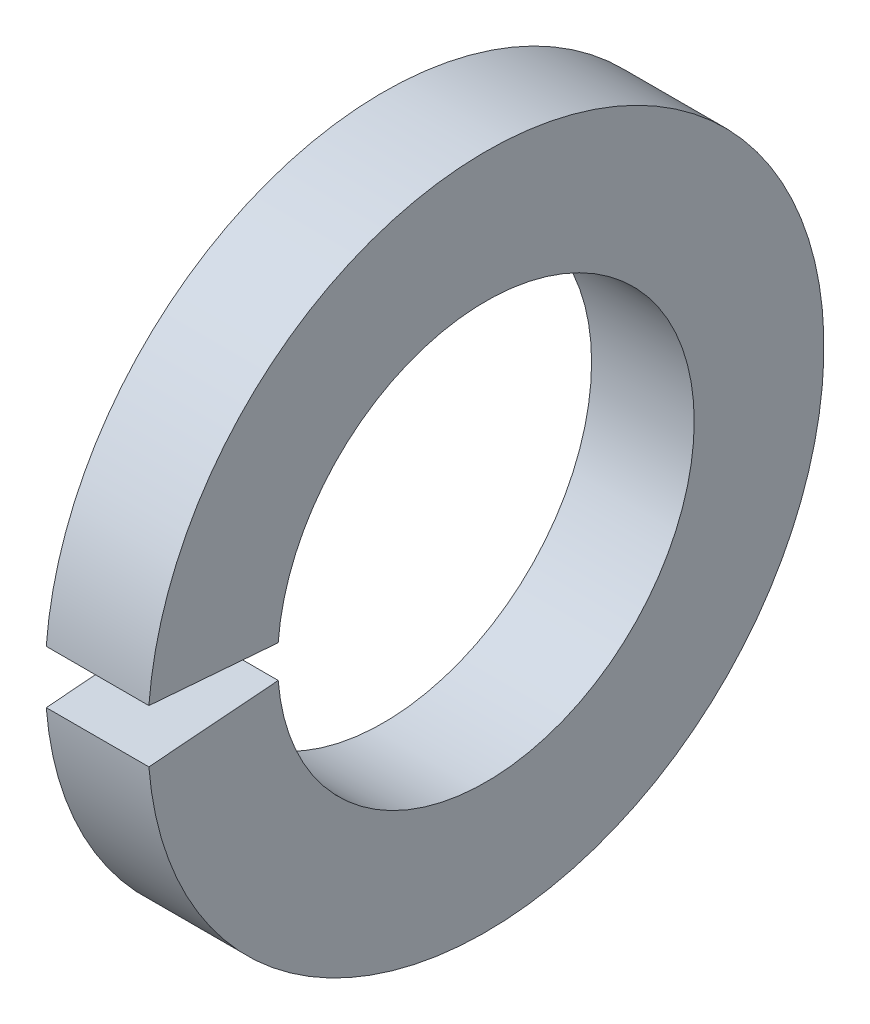
ISO-10303-21;
HEADER;
FILE_DESCRIPTION(('STEP AP214'),'2;1');
FILE_NAME('part.step','',(''),(''),'','','');
FILE_SCHEMA(('AUTOMOTIVE_DESIGN { 1 0 10303 214 1 1 1 1 }'));
ENDSEC;
DATA;
#1=APPLICATION_CONTEXT('core data for automotive mechanical design processes');
#2=APPLICATION_PROTOCOL_DEFINITION('international standard','automotive_design',2000,#1);
#3=PRODUCT_CONTEXT('',#1,'mechanical');
#4=PRODUCT('Part','Part','',(#3));
#5=PRODUCT_RELATED_PRODUCT_CATEGORY('part','',(#4));
#6=PRODUCT_DEFINITION_FORMATION('','',#4);
#7=PRODUCT_DEFINITION_CONTEXT('part definition',#1,'design');
#8=PRODUCT_DEFINITION('design','',#6,#7);
#9=PRODUCT_DEFINITION_SHAPE('','',#8);
#10=(LENGTH_UNIT() NAMED_UNIT(*) SI_UNIT(.MILLI.,.METRE.));
#11=(NAMED_UNIT(*) PLANE_ANGLE_UNIT() SI_UNIT($,.RADIAN.));
#12=(NAMED_UNIT(*) SI_UNIT($,.STERADIAN.) SOLID_ANGLE_UNIT());
#13=UNCERTAINTY_MEASURE_WITH_UNIT(LENGTH_MEASURE(1.E-05),#10,'distance_accuracy_value','');
#14=(GEOMETRIC_REPRESENTATION_CONTEXT(3) GLOBAL_UNCERTAINTY_ASSIGNED_CONTEXT((#13)) GLOBAL_UNIT_ASSIGNED_CONTEXT((#10,
#11,#12)) REPRESENTATION_CONTEXT('',''));
#15=CARTESIAN_POINT('',(0.,0.,0.));
#16=DIRECTION('',(0.,0.,1.));
#17=DIRECTION('',(1.,0.,0.));
#18=AXIS2_PLACEMENT_3D('',#15,#16,#17);
#19=CARTESIAN_POINT('',(-34.9249999999999,0.,0.));
#20=DIRECTION('',(-1.,0.,0.));
#21=DIRECTION('',(0.,0.,1.));
#22=AXIS2_PLACEMENT_3D('',#19,#20,#21);
#23=CYLINDRICAL_SURFACE('',#22,12.8905);
#24=CARTESIAN_POINT('',(0.,0.,0.));
#25=DIRECTION('',(-1.,0.,0.));
#26=DIRECTION('',(0.,0.,1.));
#27=AXIS2_PLACEMENT_3D('',#24,#25,#26);
#28=CIRCLE('',#27,12.8905);
#29=CARTESIAN_POINT('',(0.,1.01137697347979,12.8507628904869));
#30=VERTEX_POINT('',#29);
#31=CARTESIAN_POINT('',(0.,-1.01137697347979,12.8507628904869));
#32=VERTEX_POINT('',#31);
#33=EDGE_CURVE('E84',#30,#32,#28,.T.);
#34=ORIENTED_EDGE('',*,*,#33,.F.);
#35=DIRECTION('',(-1.,0.,0.));
#36=VECTOR('',#35,1.);
#37=CARTESIAN_POINT('',(-34.9249999999999,1.01137697347979,12.8507628904869));
#38=LINE('',#37,#36);
#39=CARTESIAN_POINT('',(-6.35,1.01137697347979,12.8507628904869));
#40=VERTEX_POINT('',#39);
#41=EDGE_CURVE('E98',#30,#40,#38,.T.);
#42=ORIENTED_EDGE('',*,*,#41,.T.);
#43=CARTESIAN_POINT('',(-6.35,0.,0.));
#44=DIRECTION('',(-1.,0.,0.));
#45=DIRECTION('',(0.,0.,1.));
#46=AXIS2_PLACEMENT_3D('',#43,#44,#45);
#47=CIRCLE('',#46,12.8905);
#48=CARTESIAN_POINT('',(-6.35,-1.01137697347979,12.8507628904869));
#49=VERTEX_POINT('',#48);
#50=EDGE_CURVE('E86',#40,#49,#47,.T.);
#51=ORIENTED_EDGE('',*,*,#50,.T.);
#52=DIRECTION('',(-1.,0.,0.));
#53=VECTOR('',#52,1.);
#54=CARTESIAN_POINT('',(-34.9249999999999,-1.01137697347979,12.8507628904869));
#55=LINE('',#54,#53);
#56=EDGE_CURVE('E54',#32,#49,#55,.T.);
#57=ORIENTED_EDGE('',*,*,#56,.F.);
#58=EDGE_LOOP('',(#34,#42,#51,#57));
#59=FACE_BOUND('',#58,.T.);
#60=ADVANCED_FACE('F33',(#59),#23,.F.);
#61=CARTESIAN_POINT('',(0.,12.8905,0.));
#62=DIRECTION('',(-1.,0.,0.));
#63=DIRECTION('',(0.,0.,1.));
#64=AXIS2_PLACEMENT_3D('',#61,#62,#63);
#65=PLANE('',#64);
#66=CARTESIAN_POINT('',(0.,0.,0.));
#67=DIRECTION('',(-1.,0.,0.));
#68=DIRECTION('',(0.,0.,1.));
#69=AXIS2_PLACEMENT_3D('',#66,#67,#68);
#70=CIRCLE('',#69,20.9169);
#71=CARTESIAN_POINT('',(0.,1.64112105942977,20.8524201779625));
#72=VERTEX_POINT('',#71);
#73=CARTESIAN_POINT('',(0.,-1.64112105942977,20.8524201779625));
#74=VERTEX_POINT('',#73);
#75=EDGE_CURVE('E90',#72,#74,#70,.T.);
#76=ORIENTED_EDGE('',*,*,#75,.F.);
#77=DIRECTION('',(0.,0.0784590957278456,0.996917333733128));
#78=VECTOR('',#77,1.);
#79=CARTESIAN_POINT('',(0.,0.,0.));
#80=LINE('',#79,#78);
#81=EDGE_CURVE('E78',#30,#72,#80,.T.);
#82=ORIENTED_EDGE('',*,*,#81,.F.);
#83=ORIENTED_EDGE('',*,*,#33,.T.);
#84=DIRECTION('',(0.,-0.0784590957278456,0.996917333733128));
#85=VECTOR('',#84,1.);
#86=CARTESIAN_POINT('',(0.,0.,0.));
#87=LINE('',#86,#85);
#88=EDGE_CURVE('E70',#32,#74,#87,.T.);
#89=ORIENTED_EDGE('',*,*,#88,.T.);
#90=EDGE_LOOP('',(#76,#82,#83,#89));
#91=FACE_BOUND('',#90,.T.);
#92=ADVANCED_FACE('F89',(#91),#65,.F.);
#93=CARTESIAN_POINT('',(-34.9249999999999,0.,0.));
#94=DIRECTION('',(-1.,0.,0.));
#95=DIRECTION('',(0.,0.,1.));
#96=AXIS2_PLACEMENT_3D('',#93,#94,#95);
#97=CYLINDRICAL_SURFACE('',#96,20.9169);
#98=CARTESIAN_POINT('',(-6.35,0.,0.));
#99=DIRECTION('',(-1.,0.,0.));
#100=DIRECTION('',(0.,0.,1.));
#101=AXIS2_PLACEMENT_3D('',#98,#99,#100);
#102=CIRCLE('',#101,20.9169);
#103=CARTESIAN_POINT('',(-6.35,1.64112105942978,20.8524201779625));
#104=VERTEX_POINT('',#103);
#105=CARTESIAN_POINT('',(-6.35,-1.64112105942977,20.8524201779625));
#106=VERTEX_POINT('',#105);
#107=EDGE_CURVE('E92',#104,#106,#102,.T.);
#108=ORIENTED_EDGE('',*,*,#107,.F.);
#109=DIRECTION('',(-1.,0.,0.));
#110=VECTOR('',#109,1.);
#111=CARTESIAN_POINT('',(-34.9249999999999,1.64112105942977,20.8524201779625));
#112=LINE('',#111,#110);
#113=EDGE_CURVE('E47',#104,#72,#112,.F.);
#114=ORIENTED_EDGE('',*,*,#113,.T.);
#115=ORIENTED_EDGE('',*,*,#75,.T.);
#116=DIRECTION('',(-1.,0.,0.));
#117=VECTOR('',#116,1.);
#118=CARTESIAN_POINT('',(-34.9249999999999,-1.64112105942977,20.8524201779625));
#119=LINE('',#118,#117);
#120=EDGE_CURVE('E73',#106,#74,#119,.F.);
#121=ORIENTED_EDGE('',*,*,#120,.F.);
#122=EDGE_LOOP('',(#108,#114,#115,#121));
#123=FACE_BOUND('',#122,.T.);
#124=ADVANCED_FACE('F105',(#123),#97,.T.);
#125=CARTESIAN_POINT('',(-6.35,20.9169,0.));
#126=DIRECTION('',(1.,0.,0.));
#127=DIRECTION('',(0.,0.,-1.));
#128=AXIS2_PLACEMENT_3D('',#125,#126,#127);
#129=PLANE('',#128);
#130=ORIENTED_EDGE('',*,*,#50,.F.);
#131=DIRECTION('',(0.,0.0784590957278456,0.996917333733128));
#132=VECTOR('',#131,1.);
#133=CARTESIAN_POINT('',(-6.35,0.128760874302785,1.63606203090002));
#134=LINE('',#133,#132);
#135=EDGE_CURVE('E11',#40,#104,#134,.T.);
#136=ORIENTED_EDGE('',*,*,#135,.T.);
#137=ORIENTED_EDGE('',*,*,#107,.T.);
#138=DIRECTION('',(0.,-0.0784590957278456,0.996917333733128));
#139=VECTOR('',#138,1.);
#140=CARTESIAN_POINT('',(-6.35,0.128760874302785,-1.63606203090002));
#141=LINE('',#140,#139);
#142=EDGE_CURVE('E40',#49,#106,#141,.T.);
#143=ORIENTED_EDGE('',*,*,#142,.F.);
#144=EDGE_LOOP('',(#130,#136,#137,#143));
#145=FACE_BOUND('',#144,.T.);
#146=ADVANCED_FACE('F107',(#145),#129,.F.);
#147=CARTESIAN_POINT('',(-6.35,0.,0.));
#148=DIRECTION('',(0.,0.996917333733128,0.0784590957278456));
#149=DIRECTION('',(0.,-0.0784590957278456,0.996917333733128));
#150=AXIS2_PLACEMENT_3D('',#147,#148,#149);
#151=PLANE('',#150);
#152=ORIENTED_EDGE('',*,*,#56,.T.);
#153=ORIENTED_EDGE('',*,*,#142,.T.);
#154=ORIENTED_EDGE('',*,*,#120,.T.);
#155=ORIENTED_EDGE('',*,*,#88,.F.);
#156=EDGE_LOOP('',(#152,#153,#154,#155));
#157=FACE_BOUND('',#156,.T.);
#158=ADVANCED_FACE('F71',(#157),#151,.T.);
#159=CARTESIAN_POINT('',(-6.35,0.,0.));
#160=DIRECTION('',(0.,0.996917333733128,-0.0784590957278456));
#161=DIRECTION('',(0.,0.0784590957278456,0.996917333733128));
#162=AXIS2_PLACEMENT_3D('',#159,#160,#161);
#163=PLANE('',#162);
#164=ORIENTED_EDGE('',*,*,#81,.T.);
#165=ORIENTED_EDGE('',*,*,#113,.F.);
#166=ORIENTED_EDGE('',*,*,#135,.F.);
#167=ORIENTED_EDGE('',*,*,#41,.F.);
#168=EDGE_LOOP('',(#164,#165,#166,#167));
#169=FACE_BOUND('',#168,.T.);
#170=ADVANCED_FACE('F102',(#169),#163,.F.);
#171=CLOSED_SHELL('',(#60,#92,#124,#146,#158,#170));
#172=MANIFOLD_SOLID_BREP('B2',#171);
#173=ADVANCED_BREP_SHAPE_REPRESENTATION('',(#18,#172),#14);
#174=SHAPE_DEFINITION_REPRESENTATION(#9,#173);
ENDSEC;
END-ISO-10303-21;
